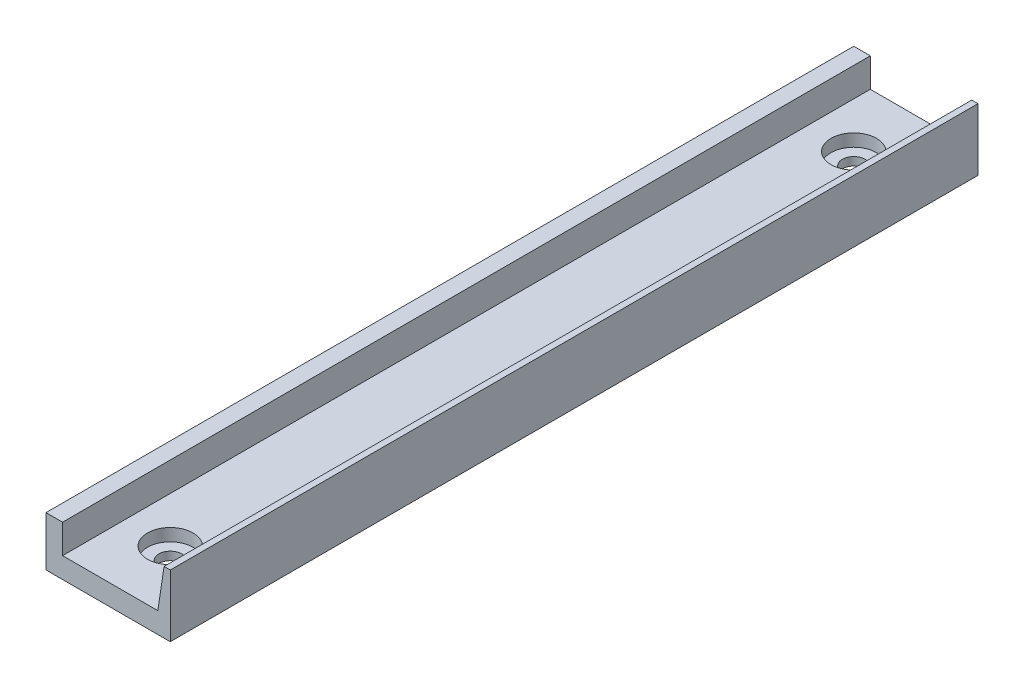
ISO-10303-21;
HEADER;
FILE_DESCRIPTION(('STEP AP214'),'2;1');
FILE_NAME('part.step','',(''),(''),'','','');
FILE_SCHEMA(('AUTOMOTIVE_DESIGN { 1 0 10303 214 1 1 1 1 }'));
ENDSEC;
DATA;
#1=APPLICATION_CONTEXT('core data for automotive mechanical design processes');
#2=APPLICATION_PROTOCOL_DEFINITION('international standard','automotive_design',2000,#1);
#3=PRODUCT_CONTEXT('',#1,'mechanical');
#4=PRODUCT('Part','Part','',(#3));
#5=PRODUCT_RELATED_PRODUCT_CATEGORY('part','',(#4));
#6=PRODUCT_DEFINITION_FORMATION('','',#4);
#7=PRODUCT_DEFINITION_CONTEXT('part definition',#1,'design');
#8=PRODUCT_DEFINITION('design','',#6,#7);
#9=PRODUCT_DEFINITION_SHAPE('','',#8);
#10=(LENGTH_UNIT() NAMED_UNIT(*) SI_UNIT(.MILLI.,.METRE.));
#11=(NAMED_UNIT(*) PLANE_ANGLE_UNIT() SI_UNIT($,.RADIAN.));
#12=(NAMED_UNIT(*) SI_UNIT($,.STERADIAN.) SOLID_ANGLE_UNIT());
#13=UNCERTAINTY_MEASURE_WITH_UNIT(LENGTH_MEASURE(1.E-05),#10,'distance_accuracy_value','');
#14=(GEOMETRIC_REPRESENTATION_CONTEXT(3) GLOBAL_UNCERTAINTY_ASSIGNED_CONTEXT((#13)) GLOBAL_UNIT_ASSIGNED_CONTEXT((#10,
#11,#12)) REPRESENTATION_CONTEXT('',''));
#15=CARTESIAN_POINT('',(0.,0.,0.));
#16=DIRECTION('',(0.,0.,1.));
#17=DIRECTION('',(1.,0.,0.));
#18=AXIS2_PLACEMENT_3D('',#15,#16,#17);
#19=CARTESIAN_POINT('',(0.,0.,0.));
#20=DIRECTION('',(0.,1.,0.));
#21=DIRECTION('',(0.,0.,1.));
#22=AXIS2_PLACEMENT_3D('',#19,#20,#21);
#23=PLANE('',#22);
#24=DIRECTION('',(0.,0.,-1.));
#25=VECTOR('',#24,1.);
#26=CARTESIAN_POINT('',(15.,0.,-97.5));
#27=LINE('',#26,#25);
#28=CARTESIAN_POINT('',(15.,0.,97.5));
#29=VERTEX_POINT('',#28);
#30=CARTESIAN_POINT('',(15.,0.,-97.5));
#31=VERTEX_POINT('',#30);
#32=EDGE_CURVE('E245',#29,#31,#27,.T.);
#33=ORIENTED_EDGE('',*,*,#32,.F.);
#34=DIRECTION('',(1.,0.,0.));
#35=VECTOR('',#34,1.);
#36=CARTESIAN_POINT('',(-15.,0.,97.5));
#37=LINE('',#36,#35);
#38=CARTESIAN_POINT('',(-15.,0.,97.5));
#39=VERTEX_POINT('',#38);
#40=EDGE_CURVE('E251',#39,#29,#37,.T.);
#41=ORIENTED_EDGE('',*,*,#40,.F.);
#42=DIRECTION('',(0.,0.,1.));
#43=VECTOR('',#42,1.);
#44=CARTESIAN_POINT('',(-15.,0.,-97.5));
#45=LINE('',#44,#43);
#46=CARTESIAN_POINT('',(-15.,0.,-97.5));
#47=VERTEX_POINT('',#46);
#48=EDGE_CURVE('E263',#47,#39,#45,.T.);
#49=ORIENTED_EDGE('',*,*,#48,.F.);
#50=DIRECTION('',(-1.,0.,0.));
#51=VECTOR('',#50,1.);
#52=CARTESIAN_POINT('',(-15.,0.,-97.5));
#53=LINE('',#52,#51);
#54=EDGE_CURVE('E259',#31,#47,#53,.T.);
#55=ORIENTED_EDGE('',*,*,#54,.F.);
#56=EDGE_LOOP('',(#33,#41,#49,#55));
#57=FACE_BOUND('',#56,.T.);
#58=CARTESIAN_POINT('',(0.,0.,-82.5));
#59=DIRECTION('',(0.,1.,0.));
#60=DIRECTION('',(0.,0.,1.));
#61=AXIS2_PLACEMENT_3D('',#58,#59,#60);
#62=CIRCLE('',#61,2.75);
#63=CARTESIAN_POINT('',(0.,0.,-79.75));
#64=VERTEX_POINT('',#63);
#65=EDGE_CURVE('E192',#64,#64,#62,.T.);
#66=ORIENTED_EDGE('',*,*,#65,.T.);
#67=EDGE_LOOP('',(#66));
#68=FACE_BOUND('',#67,.T.);
#69=CARTESIAN_POINT('',(0.,0.,82.5));
#70=DIRECTION('',(0.,1.,0.));
#71=DIRECTION('',(0.,0.,1.));
#72=AXIS2_PLACEMENT_3D('',#69,#70,#71);
#73=CIRCLE('',#72,2.75);
#74=CARTESIAN_POINT('',(0.,0.,85.25));
#75=VERTEX_POINT('',#74);
#76=EDGE_CURVE('E176',#75,#75,#73,.T.);
#77=ORIENTED_EDGE('',*,*,#76,.T.);
#78=EDGE_LOOP('',(#77));
#79=FACE_BOUND('',#78,.T.);
#80=DIRECTION('',(0.,0.,1.));
#81=VECTOR('',#80,1.);
#82=CARTESIAN_POINT('',(3.04999999999999,0.,60.));
#83=LINE('',#82,#81);
#84=CARTESIAN_POINT('',(3.05000000000001,0.,-60.));
#85=VERTEX_POINT('',#84);
#86=CARTESIAN_POINT('',(3.04999999999999,0.,60.));
#87=VERTEX_POINT('',#86);
#88=EDGE_CURVE('E156',#85,#87,#83,.T.);
#89=ORIENTED_EDGE('',*,*,#88,.F.);
#90=DIRECTION('',(1.,0.,0.));
#91=VECTOR('',#90,1.);
#92=CARTESIAN_POINT('',(-3.04999999999999,0.,-60.));
#93=LINE('',#92,#91);
#94=CARTESIAN_POINT('',(-3.04999999999999,0.,-60.));
#95=VERTEX_POINT('',#94);
#96=EDGE_CURVE('E153',#95,#85,#93,.T.);
#97=ORIENTED_EDGE('',*,*,#96,.F.);
#98=DIRECTION('',(0.,0.,-1.));
#99=VECTOR('',#98,1.);
#100=CARTESIAN_POINT('',(-3.05000000000001,0.,60.));
#101=LINE('',#100,#99);
#102=CARTESIAN_POINT('',(-3.05000000000001,0.,60.));
#103=VERTEX_POINT('',#102);
#104=EDGE_CURVE('E65',#103,#95,#101,.T.);
#105=ORIENTED_EDGE('',*,*,#104,.F.);
#106=DIRECTION('',(-1.,0.,0.));
#107=VECTOR('',#106,1.);
#108=CARTESIAN_POINT('',(-3.05000000000001,0.,60.));
#109=LINE('',#108,#107);
#110=EDGE_CURVE('E60',#87,#103,#109,.T.);
#111=ORIENTED_EDGE('',*,*,#110,.F.);
#112=EDGE_LOOP('',(#89,#97,#105,#111));
#113=FACE_BOUND('',#112,.T.);
#114=ADVANCED_FACE('F44',(#57,#68,#79,#113),#23,.F.);
#115=CARTESIAN_POINT('',(0.,5.,0.));
#116=DIRECTION('',(0.,1.,0.));
#117=DIRECTION('',(0.,0.,1.));
#118=AXIS2_PLACEMENT_3D('',#115,#116,#117);
#119=PLANE('',#118);
#120=CARTESIAN_POINT('',(0.,5.,82.5));
#121=DIRECTION('',(0.,1.,0.));
#122=DIRECTION('',(0.,0.,1.));
#123=AXIS2_PLACEMENT_3D('',#120,#121,#122);
#124=CIRCLE('',#123,5.5);
#125=CARTESIAN_POINT('',(0.,5.,88.));
#126=VERTEX_POINT('',#125);
#127=EDGE_CURVE('E158',#126,#126,#124,.T.);
#128=ORIENTED_EDGE('',*,*,#127,.F.);
#129=EDGE_LOOP('',(#128));
#130=FACE_BOUND('',#129,.T.);
#131=CARTESIAN_POINT('',(0.,5.,-82.5));
#132=DIRECTION('',(0.,1.,0.));
#133=DIRECTION('',(0.,0.,1.));
#134=AXIS2_PLACEMENT_3D('',#131,#132,#133);
#135=CIRCLE('',#134,5.5);
#136=CARTESIAN_POINT('',(0.,5.,-77.));
#137=VERTEX_POINT('',#136);
#138=EDGE_CURVE('E180',#137,#137,#135,.T.);
#139=ORIENTED_EDGE('',*,*,#138,.F.);
#140=EDGE_LOOP('',(#139));
#141=FACE_BOUND('',#140,.T.);
#142=DIRECTION('',(1.,0.,0.));
#143=VECTOR('',#142,1.);
#144=CARTESIAN_POINT('',(-15.,5.,97.5));
#145=LINE('',#144,#143);
#146=CARTESIAN_POINT('',(-11.,5.,97.5));
#147=VERTEX_POINT('',#146);
#148=CARTESIAN_POINT('',(12.,5.,97.5));
#149=VERTEX_POINT('',#148);
#150=EDGE_CURVE('E250',#147,#149,#145,.T.);
#151=ORIENTED_EDGE('',*,*,#150,.T.);
#152=DIRECTION('',(0.,0.,1.));
#153=VECTOR('',#152,1.);
#154=CARTESIAN_POINT('',(12.,5.,-97.5));
#155=LINE('',#154,#153);
#156=CARTESIAN_POINT('',(12.,5.,-97.5));
#157=VERTEX_POINT('',#156);
#158=EDGE_CURVE('E222',#157,#149,#155,.T.);
#159=ORIENTED_EDGE('',*,*,#158,.F.);
#160=DIRECTION('',(-1.,0.,0.));
#161=VECTOR('',#160,1.);
#162=CARTESIAN_POINT('',(-15.,5.,-97.5));
#163=LINE('',#162,#161);
#164=CARTESIAN_POINT('',(-11.,5.,-97.5));
#165=VERTEX_POINT('',#164);
#166=EDGE_CURVE('E246',#157,#165,#163,.T.);
#167=ORIENTED_EDGE('',*,*,#166,.T.);
#168=DIRECTION('',(0.,0.,-1.));
#169=VECTOR('',#168,1.);
#170=CARTESIAN_POINT('',(-11.,5.,-97.5));
#171=LINE('',#170,#169);
#172=EDGE_CURVE('E225',#147,#165,#171,.T.);
#173=ORIENTED_EDGE('',*,*,#172,.F.);
#174=EDGE_LOOP('',(#151,#159,#167,#173));
#175=FACE_BOUND('',#174,.T.);
#176=ADVANCED_FACE('F304',(#130,#141,#175),#119,.T.);
#177=CARTESIAN_POINT('',(15.,5.,-97.5));
#178=DIRECTION('',(-1.,0.,0.));
#179=DIRECTION('',(0.,0.,1.));
#180=AXIS2_PLACEMENT_3D('',#177,#178,#179);
#181=PLANE('',#180);
#182=ORIENTED_EDGE('',*,*,#32,.T.);
#183=DIRECTION('',(0.,-1.,0.));
#184=VECTOR('',#183,1.);
#185=CARTESIAN_POINT('',(15.,5.,-97.5));
#186=LINE('',#185,#184);
#187=CARTESIAN_POINT('',(15.,15.,-97.5));
#188=VERTEX_POINT('',#187);
#189=EDGE_CURVE('E11',#188,#31,#186,.T.);
#190=ORIENTED_EDGE('',*,*,#189,.F.);
#191=DIRECTION('',(0.,0.,-1.));
#192=VECTOR('',#191,1.);
#193=CARTESIAN_POINT('',(15.,15.,-97.5));
#194=LINE('',#193,#192);
#195=CARTESIAN_POINT('',(15.,15.,97.5));
#196=VERTEX_POINT('',#195);
#197=EDGE_CURVE('E226',#196,#188,#194,.T.);
#198=ORIENTED_EDGE('',*,*,#197,.F.);
#199=DIRECTION('',(0.,-1.,0.));
#200=VECTOR('',#199,1.);
#201=CARTESIAN_POINT('',(15.,5.,97.5));
#202=LINE('',#201,#200);
#203=EDGE_CURVE('E255',#196,#29,#202,.T.);
#204=ORIENTED_EDGE('',*,*,#203,.T.);
#205=EDGE_LOOP('',(#182,#190,#198,#204));
#206=FACE_BOUND('',#205,.T.);
#207=ADVANCED_FACE('F46',(#206),#181,.F.);
#208=CARTESIAN_POINT('',(-15.,5.,-97.5));
#209=DIRECTION('',(0.,0.,1.));
#210=DIRECTION('',(1.,0.,0.));
#211=AXIS2_PLACEMENT_3D('',#208,#209,#210);
#212=PLANE('',#211);
#213=DIRECTION('',(0.,-1.,0.));
#214=VECTOR('',#213,1.);
#215=CARTESIAN_POINT('',(-15.,5.,-97.5));
#216=LINE('',#215,#214);
#217=CARTESIAN_POINT('',(-15.,12.,-97.5));
#218=VERTEX_POINT('',#217);
#219=EDGE_CURVE('E53',#218,#47,#216,.T.);
#220=ORIENTED_EDGE('',*,*,#219,.F.);
#221=DIRECTION('',(1.,0.,0.));
#222=VECTOR('',#221,1.);
#223=CARTESIAN_POINT('',(-15.,12.,-97.5));
#224=LINE('',#223,#222);
#225=CARTESIAN_POINT('',(-11.,12.,-97.5));
#226=VERTEX_POINT('',#225);
#227=EDGE_CURVE('E197',#218,#226,#224,.T.);
#228=ORIENTED_EDGE('',*,*,#227,.T.);
#229=DIRECTION('',(0.,-1.,0.));
#230=VECTOR('',#229,1.);
#231=CARTESIAN_POINT('',(-11.,15.,-97.5));
#232=LINE('',#231,#230);
#233=EDGE_CURVE('E239',#226,#165,#232,.T.);
#234=ORIENTED_EDGE('',*,*,#233,.T.);
#235=ORIENTED_EDGE('',*,*,#166,.F.);
#236=DIRECTION('',(0.148340452930243,0.988936352868298,0.));
#237=VECTOR('',#236,1.);
#238=CARTESIAN_POINT('',(13.5,15.,-97.5));
#239=LINE('',#238,#237);
#240=CARTESIAN_POINT('',(13.5,15.,-97.5));
#241=VERTEX_POINT('',#240);
#242=EDGE_CURVE('E216',#157,#241,#239,.T.);
#243=ORIENTED_EDGE('',*,*,#242,.T.);
#244=DIRECTION('',(-1.,0.,0.));
#245=VECTOR('',#244,1.);
#246=CARTESIAN_POINT('',(15.,15.,-97.5));
#247=LINE('',#246,#245);
#248=EDGE_CURVE('E229',#188,#241,#247,.T.);
#249=ORIENTED_EDGE('',*,*,#248,.F.);
#250=ORIENTED_EDGE('',*,*,#189,.T.);
#251=ORIENTED_EDGE('',*,*,#54,.T.);
#252=EDGE_LOOP('',(#220,#228,#234,#235,#243,#249,#250,#251));
#253=FACE_BOUND('',#252,.T.);
#254=ADVANCED_FACE('F283',(#253),#212,.F.);
#255=CARTESIAN_POINT('',(-15.,5.,-97.5));
#256=DIRECTION('',(1.,0.,0.));
#257=DIRECTION('',(0.,0.,-1.));
#258=AXIS2_PLACEMENT_3D('',#255,#256,#257);
#259=PLANE('',#258);
#260=DIRECTION('',(0.,-1.,0.));
#261=VECTOR('',#260,1.);
#262=CARTESIAN_POINT('',(-15.,5.,97.5));
#263=LINE('',#262,#261);
#264=CARTESIAN_POINT('',(-15.,12.,97.5));
#265=VERTEX_POINT('',#264);
#266=EDGE_CURVE('E272',#265,#39,#263,.T.);
#267=ORIENTED_EDGE('',*,*,#266,.F.);
#268=DIRECTION('',(0.,0.,1.));
#269=VECTOR('',#268,1.);
#270=CARTESIAN_POINT('',(-15.,12.,-97.5));
#271=LINE('',#270,#269);
#272=EDGE_CURVE('E201',#218,#265,#271,.T.);
#273=ORIENTED_EDGE('',*,*,#272,.F.);
#274=ORIENTED_EDGE('',*,*,#219,.T.);
#275=ORIENTED_EDGE('',*,*,#48,.T.);
#276=EDGE_LOOP('',(#267,#273,#274,#275));
#277=FACE_BOUND('',#276,.T.);
#278=ADVANCED_FACE('F279',(#277),#259,.F.);
#279=CARTESIAN_POINT('',(-15.,5.,97.5));
#280=DIRECTION('',(0.,0.,-1.));
#281=DIRECTION('',(-1.,0.,0.));
#282=AXIS2_PLACEMENT_3D('',#279,#280,#281);
#283=PLANE('',#282);
#284=DIRECTION('',(0.,-1.,0.));
#285=VECTOR('',#284,1.);
#286=CARTESIAN_POINT('',(-11.,15.,97.5));
#287=LINE('',#286,#285);
#288=CARTESIAN_POINT('',(-11.,12.,97.5));
#289=VERTEX_POINT('',#288);
#290=EDGE_CURVE('E242',#289,#147,#287,.T.);
#291=ORIENTED_EDGE('',*,*,#290,.F.);
#292=DIRECTION('',(1.,0.,0.));
#293=VECTOR('',#292,1.);
#294=CARTESIAN_POINT('',(-15.,12.,97.5));
#295=LINE('',#294,#293);
#296=EDGE_CURVE('E202',#265,#289,#295,.T.);
#297=ORIENTED_EDGE('',*,*,#296,.F.);
#298=ORIENTED_EDGE('',*,*,#266,.T.);
#299=ORIENTED_EDGE('',*,*,#40,.T.);
#300=ORIENTED_EDGE('',*,*,#203,.F.);
#301=DIRECTION('',(1.,0.,0.));
#302=VECTOR('',#301,1.);
#303=CARTESIAN_POINT('',(15.,15.,97.5));
#304=LINE('',#303,#302);
#305=CARTESIAN_POINT('',(13.5,15.,97.5));
#306=VERTEX_POINT('',#305);
#307=EDGE_CURVE('E210',#306,#196,#304,.T.);
#308=ORIENTED_EDGE('',*,*,#307,.F.);
#309=DIRECTION('',(0.148340452930243,0.988936352868298,0.));
#310=VECTOR('',#309,1.);
#311=CARTESIAN_POINT('',(13.5,15.,97.5));
#312=LINE('',#311,#310);
#313=EDGE_CURVE('E205',#149,#306,#312,.T.);
#314=ORIENTED_EDGE('',*,*,#313,.F.);
#315=ORIENTED_EDGE('',*,*,#150,.F.);
#316=EDGE_LOOP('',(#291,#297,#298,#299,#300,#308,#314,#315));
#317=FACE_BOUND('',#316,.T.);
#318=ADVANCED_FACE('F291',(#317),#283,.F.);
#319=CARTESIAN_POINT('',(-11.,15.,-97.5));
#320=DIRECTION('',(-1.,0.,0.));
#321=DIRECTION('',(0.,0.,1.));
#322=AXIS2_PLACEMENT_3D('',#319,#320,#321);
#323=PLANE('',#322);
#324=ORIENTED_EDGE('',*,*,#233,.F.);
#325=DIRECTION('',(0.,0.,1.));
#326=VECTOR('',#325,1.);
#327=CARTESIAN_POINT('',(-11.,12.,-97.5));
#328=LINE('',#327,#326);
#329=EDGE_CURVE('E206',#226,#289,#328,.T.);
#330=ORIENTED_EDGE('',*,*,#329,.T.);
#331=ORIENTED_EDGE('',*,*,#290,.T.);
#332=ORIENTED_EDGE('',*,*,#172,.T.);
#333=EDGE_LOOP('',(#324,#330,#331,#332));
#334=FACE_BOUND('',#333,.T.);
#335=ADVANCED_FACE('F308',(#334),#323,.F.);
#336=CARTESIAN_POINT('',(0.,15.,0.));
#337=DIRECTION('',(0.,-1.,0.));
#338=DIRECTION('',(0.,0.,-1.));
#339=AXIS2_PLACEMENT_3D('',#336,#337,#338);
#340=PLANE('',#339);
#341=ORIENTED_EDGE('',*,*,#248,.T.);
#342=DIRECTION('',(0.,0.,1.));
#343=VECTOR('',#342,1.);
#344=CARTESIAN_POINT('',(13.5,15.,-97.5));
#345=LINE('',#344,#343);
#346=EDGE_CURVE('E196',#241,#306,#345,.T.);
#347=ORIENTED_EDGE('',*,*,#346,.T.);
#348=ORIENTED_EDGE('',*,*,#307,.T.);
#349=ORIENTED_EDGE('',*,*,#197,.T.);
#350=EDGE_LOOP('',(#341,#347,#348,#349));
#351=FACE_BOUND('',#350,.T.);
#352=ADVANCED_FACE('F297',(#351),#340,.F.);
#353=CARTESIAN_POINT('',(13.5,15.,-97.5));
#354=DIRECTION('',(0.988936352868298,-0.148340452930243,0.));
#355=DIRECTION('',(0.148340452930243,0.988936352868298,0.));
#356=AXIS2_PLACEMENT_3D('',#353,#354,#355);
#357=PLANE('',#356);
#358=ORIENTED_EDGE('',*,*,#313,.T.);
#359=ORIENTED_EDGE('',*,*,#346,.F.);
#360=ORIENTED_EDGE('',*,*,#242,.F.);
#361=ORIENTED_EDGE('',*,*,#158,.T.);
#362=EDGE_LOOP('',(#358,#359,#360,#361));
#363=FACE_BOUND('',#362,.T.);
#364=ADVANCED_FACE('F311',(#363),#357,.F.);
#365=CARTESIAN_POINT('',(-15.,12.,-97.5));
#366=DIRECTION('',(0.,-1.,0.));
#367=DIRECTION('',(0.,0.,-1.));
#368=AXIS2_PLACEMENT_3D('',#365,#366,#367);
#369=PLANE('',#368);
#370=ORIENTED_EDGE('',*,*,#296,.T.);
#371=ORIENTED_EDGE('',*,*,#329,.F.);
#372=ORIENTED_EDGE('',*,*,#227,.F.);
#373=ORIENTED_EDGE('',*,*,#272,.T.);
#374=EDGE_LOOP('',(#370,#371,#372,#373));
#375=FACE_BOUND('',#374,.T.);
#376=ADVANCED_FACE('F310',(#375),#369,.F.);
#377=CARTESIAN_POINT('',(0.,5.,-82.5));
#378=DIRECTION('',(0.,1.,0.));
#379=DIRECTION('',(0.,0.,1.));
#380=AXIS2_PLACEMENT_3D('',#377,#378,#379);
#381=CYLINDRICAL_SURFACE('',#380,2.75);
#382=ORIENTED_EDGE('',*,*,#65,.F.);
#383=EDGE_LOOP('',(#382));
#384=FACE_BOUND('',#383,.T.);
#385=CARTESIAN_POINT('',(0.,2.,-82.5));
#386=DIRECTION('',(0.,1.,0.));
#387=DIRECTION('',(0.,0.,1.));
#388=AXIS2_PLACEMENT_3D('',#385,#386,#387);
#389=CIRCLE('',#388,2.75);
#390=CARTESIAN_POINT('',(0.,2.,-79.75));
#391=VERTEX_POINT('',#390);
#392=EDGE_CURVE('E188',#391,#391,#389,.T.);
#393=ORIENTED_EDGE('',*,*,#392,.T.);
#394=EDGE_LOOP('',(#393));
#395=FACE_BOUND('',#394,.T.);
#396=ADVANCED_FACE('F318',(#384,#395),#381,.F.);
#397=CARTESIAN_POINT('',(2.74999999999999,2.,-82.5));
#398=DIRECTION('',(0.,-1.,0.));
#399=DIRECTION('',(0.,0.,-1.));
#400=AXIS2_PLACEMENT_3D('',#397,#398,#399);
#401=PLANE('',#400);
#402=ORIENTED_EDGE('',*,*,#392,.F.);
#403=EDGE_LOOP('',(#402));
#404=FACE_BOUND('',#403,.T.);
#405=CARTESIAN_POINT('',(0.,2.,-82.5));
#406=DIRECTION('',(0.,1.,0.));
#407=DIRECTION('',(0.,0.,1.));
#408=AXIS2_PLACEMENT_3D('',#405,#406,#407);
#409=CIRCLE('',#408,5.5);
#410=CARTESIAN_POINT('',(0.,2.,-77.));
#411=VERTEX_POINT('',#410);
#412=EDGE_CURVE('E184',#411,#411,#409,.T.);
#413=ORIENTED_EDGE('',*,*,#412,.T.);
#414=EDGE_LOOP('',(#413));
#415=FACE_BOUND('',#414,.T.);
#416=ADVANCED_FACE('F357',(#404,#415),#401,.F.);
#417=CARTESIAN_POINT('',(0.,5.,-82.5));
#418=DIRECTION('',(0.,1.,0.));
#419=DIRECTION('',(0.,0.,1.));
#420=AXIS2_PLACEMENT_3D('',#417,#418,#419);
#421=CYLINDRICAL_SURFACE('',#420,5.5);
#422=ORIENTED_EDGE('',*,*,#412,.F.);
#423=EDGE_LOOP('',(#422));
#424=FACE_BOUND('',#423,.T.);
#425=ORIENTED_EDGE('',*,*,#138,.T.);
#426=EDGE_LOOP('',(#425));
#427=FACE_BOUND('',#426,.T.);
#428=ADVANCED_FACE('F368',(#424,#427),#421,.F.);
#429=CARTESIAN_POINT('',(0.,5.,82.5));
#430=DIRECTION('',(0.,1.,0.));
#431=DIRECTION('',(0.,0.,1.));
#432=AXIS2_PLACEMENT_3D('',#429,#430,#431);
#433=CYLINDRICAL_SURFACE('',#432,2.75);
#434=ORIENTED_EDGE('',*,*,#76,.F.);
#435=EDGE_LOOP('',(#434));
#436=FACE_BOUND('',#435,.T.);
#437=CARTESIAN_POINT('',(0.,2.,82.5));
#438=DIRECTION('',(0.,1.,0.));
#439=DIRECTION('',(0.,0.,1.));
#440=AXIS2_PLACEMENT_3D('',#437,#438,#439);
#441=CIRCLE('',#440,2.75);
#442=CARTESIAN_POINT('',(0.,2.,85.25));
#443=VERTEX_POINT('',#442);
#444=EDGE_CURVE('E172',#443,#443,#441,.T.);
#445=ORIENTED_EDGE('',*,*,#444,.T.);
#446=EDGE_LOOP('',(#445));
#447=FACE_BOUND('',#446,.T.);
#448=ADVANCED_FACE('F379',(#436,#447),#433,.F.);
#449=CARTESIAN_POINT('',(2.74999999999999,2.,82.5));
#450=DIRECTION('',(0.,-1.,0.));
#451=DIRECTION('',(0.,0.,-1.));
#452=AXIS2_PLACEMENT_3D('',#449,#450,#451);
#453=PLANE('',#452);
#454=ORIENTED_EDGE('',*,*,#444,.F.);
#455=EDGE_LOOP('',(#454));
#456=FACE_BOUND('',#455,.T.);
#457=CARTESIAN_POINT('',(0.,2.,82.5));
#458=DIRECTION('',(0.,1.,0.));
#459=DIRECTION('',(0.,0.,1.));
#460=AXIS2_PLACEMENT_3D('',#457,#458,#459);
#461=CIRCLE('',#460,5.5);
#462=CARTESIAN_POINT('',(0.,2.,88.));
#463=VERTEX_POINT('',#462);
#464=EDGE_CURVE('E163',#463,#463,#461,.T.);
#465=ORIENTED_EDGE('',*,*,#464,.T.);
#466=EDGE_LOOP('',(#465));
#467=FACE_BOUND('',#466,.T.);
#468=ADVANCED_FACE('F390',(#456,#467),#453,.F.);
#469=CARTESIAN_POINT('',(0.,5.,82.5));
#470=DIRECTION('',(0.,1.,0.));
#471=DIRECTION('',(0.,0.,1.));
#472=AXIS2_PLACEMENT_3D('',#469,#470,#471);
#473=CYLINDRICAL_SURFACE('',#472,5.5);
#474=ORIENTED_EDGE('',*,*,#464,.F.);
#475=EDGE_LOOP('',(#474));
#476=FACE_BOUND('',#475,.T.);
#477=ORIENTED_EDGE('',*,*,#127,.T.);
#478=EDGE_LOOP('',(#477));
#479=FACE_BOUND('',#478,.T.);
#480=ADVANCED_FACE('F401',(#476,#479),#473,.F.);
#481=CARTESIAN_POINT('',(3.04999999999999,-6.,60.));
#482=DIRECTION('',(-1.,0.,0.));
#483=DIRECTION('',(0.,0.,1.));
#484=AXIS2_PLACEMENT_3D('',#481,#482,#483);
#485=PLANE('',#484);
#486=ORIENTED_EDGE('',*,*,#88,.T.);
#487=DIRECTION('',(0.,1.,0.));
#488=VECTOR('',#487,1.);
#489=CARTESIAN_POINT('',(3.04999999999999,-6.,60.));
#490=LINE('',#489,#488);
#491=CARTESIAN_POINT('',(3.04999999999999,-6.,60.));
#492=VERTEX_POINT('',#491);
#493=EDGE_CURVE('E135',#492,#87,#490,.T.);
#494=ORIENTED_EDGE('',*,*,#493,.F.);
#495=DIRECTION('',(0.,0.,1.));
#496=VECTOR('',#495,1.);
#497=CARTESIAN_POINT('',(3.04999999999999,-6.,60.));
#498=LINE('',#497,#496);
#499=CARTESIAN_POINT('',(3.05000000000001,-6.,-60.));
#500=VERTEX_POINT('',#499);
#501=EDGE_CURVE('E143',#500,#492,#498,.T.);
#502=ORIENTED_EDGE('',*,*,#501,.F.);
#503=DIRECTION('',(0.,1.,0.));
#504=VECTOR('',#503,1.);
#505=CARTESIAN_POINT('',(3.05000000000001,-6.,-60.));
#506=LINE('',#505,#504);
#507=EDGE_CURVE('E477',#500,#85,#506,.T.);
#508=ORIENTED_EDGE('',*,*,#507,.T.);
#509=EDGE_LOOP('',(#486,#494,#502,#508));
#510=FACE_BOUND('',#509,.T.);
#511=ADVANCED_FACE('F155',(#510),#485,.F.);
#512=CARTESIAN_POINT('',(-3.05000000000001,-6.,60.));
#513=DIRECTION('',(0.,0.,-1.));
#514=DIRECTION('',(-1.,0.,0.));
#515=AXIS2_PLACEMENT_3D('',#512,#513,#514);
#516=PLANE('',#515);
#517=ORIENTED_EDGE('',*,*,#110,.T.);
#518=DIRECTION('',(0.,1.,0.));
#519=VECTOR('',#518,1.);
#520=CARTESIAN_POINT('',(-3.05000000000001,-6.,60.));
#521=LINE('',#520,#519);
#522=CARTESIAN_POINT('',(-3.05000000000001,-6.,60.));
#523=VERTEX_POINT('',#522);
#524=EDGE_CURVE('E138',#523,#103,#521,.T.);
#525=ORIENTED_EDGE('',*,*,#524,.F.);
#526=DIRECTION('',(-1.,0.,0.));
#527=VECTOR('',#526,1.);
#528=CARTESIAN_POINT('',(-3.05000000000001,-6.,60.));
#529=LINE('',#528,#527);
#530=EDGE_CURVE('E131',#492,#523,#529,.T.);
#531=ORIENTED_EDGE('',*,*,#530,.F.);
#532=ORIENTED_EDGE('',*,*,#493,.T.);
#533=EDGE_LOOP('',(#517,#525,#531,#532));
#534=FACE_BOUND('',#533,.T.);
#535=ADVANCED_FACE('F133',(#534),#516,.F.);
#536=CARTESIAN_POINT('',(-3.05000000000001,-6.,60.));
#537=DIRECTION('',(1.,0.,0.));
#538=DIRECTION('',(0.,0.,-1.));
#539=AXIS2_PLACEMENT_3D('',#536,#537,#538);
#540=PLANE('',#539);
#541=ORIENTED_EDGE('',*,*,#104,.T.);
#542=DIRECTION('',(0.,1.,0.));
#543=VECTOR('',#542,1.);
#544=CARTESIAN_POINT('',(-3.04999999999999,-6.,-60.));
#545=LINE('',#544,#543);
#546=CARTESIAN_POINT('',(-3.04999999999999,-6.,-60.));
#547=VERTEX_POINT('',#546);
#548=EDGE_CURVE('E165',#547,#95,#545,.T.);
#549=ORIENTED_EDGE('',*,*,#548,.F.);
#550=DIRECTION('',(0.,0.,-1.));
#551=VECTOR('',#550,1.);
#552=CARTESIAN_POINT('',(-3.05000000000001,-6.,60.));
#553=LINE('',#552,#551);
#554=EDGE_CURVE('E142',#523,#547,#553,.T.);
#555=ORIENTED_EDGE('',*,*,#554,.F.);
#556=ORIENTED_EDGE('',*,*,#524,.T.);
#557=EDGE_LOOP('',(#541,#549,#555,#556));
#558=FACE_BOUND('',#557,.T.);
#559=ADVANCED_FACE('F435',(#558),#540,.F.);
#560=CARTESIAN_POINT('',(-3.04999999999999,-6.,-60.));
#561=DIRECTION('',(0.,0.,1.));
#562=DIRECTION('',(1.,0.,0.));
#563=AXIS2_PLACEMENT_3D('',#560,#561,#562);
#564=PLANE('',#563);
#565=ORIENTED_EDGE('',*,*,#96,.T.);
#566=ORIENTED_EDGE('',*,*,#507,.F.);
#567=DIRECTION('',(1.,0.,0.));
#568=VECTOR('',#567,1.);
#569=CARTESIAN_POINT('',(-3.04999999999999,-6.,-60.));
#570=LINE('',#569,#568);
#571=EDGE_CURVE('E148',#547,#500,#570,.T.);
#572=ORIENTED_EDGE('',*,*,#571,.F.);
#573=ORIENTED_EDGE('',*,*,#548,.T.);
#574=EDGE_LOOP('',(#565,#566,#572,#573));
#575=FACE_BOUND('',#574,.T.);
#576=ADVANCED_FACE('F445',(#575),#564,.F.);
#577=CARTESIAN_POINT('',(0.,-6.,0.));
#578=DIRECTION('',(0.,-1.,0.));
#579=DIRECTION('',(0.,0.,-1.));
#580=AXIS2_PLACEMENT_3D('',#577,#578,#579);
#581=PLANE('',#580);
#582=ORIENTED_EDGE('',*,*,#501,.T.);
#583=ORIENTED_EDGE('',*,*,#530,.T.);
#584=ORIENTED_EDGE('',*,*,#554,.T.);
#585=ORIENTED_EDGE('',*,*,#571,.T.);
#586=EDGE_LOOP('',(#582,#583,#584,#585));
#587=FACE_BOUND('',#586,.T.);
#588=ADVANCED_FACE('F146',(#587),#581,.T.);
#589=CLOSED_SHELL('',(#114,#176,#207,#254,#278,#318,#335,#352,#364,#376,#396,#416,#428,#448,
#468,#480,#511,#535,#559,#576,#588));
#590=MANIFOLD_SOLID_BREP('B2',#589);
#591=ADVANCED_BREP_SHAPE_REPRESENTATION('',(#18,#590),#14);
#592=SHAPE_DEFINITION_REPRESENTATION(#9,#591);
ENDSEC;
END-ISO-10303-21;
